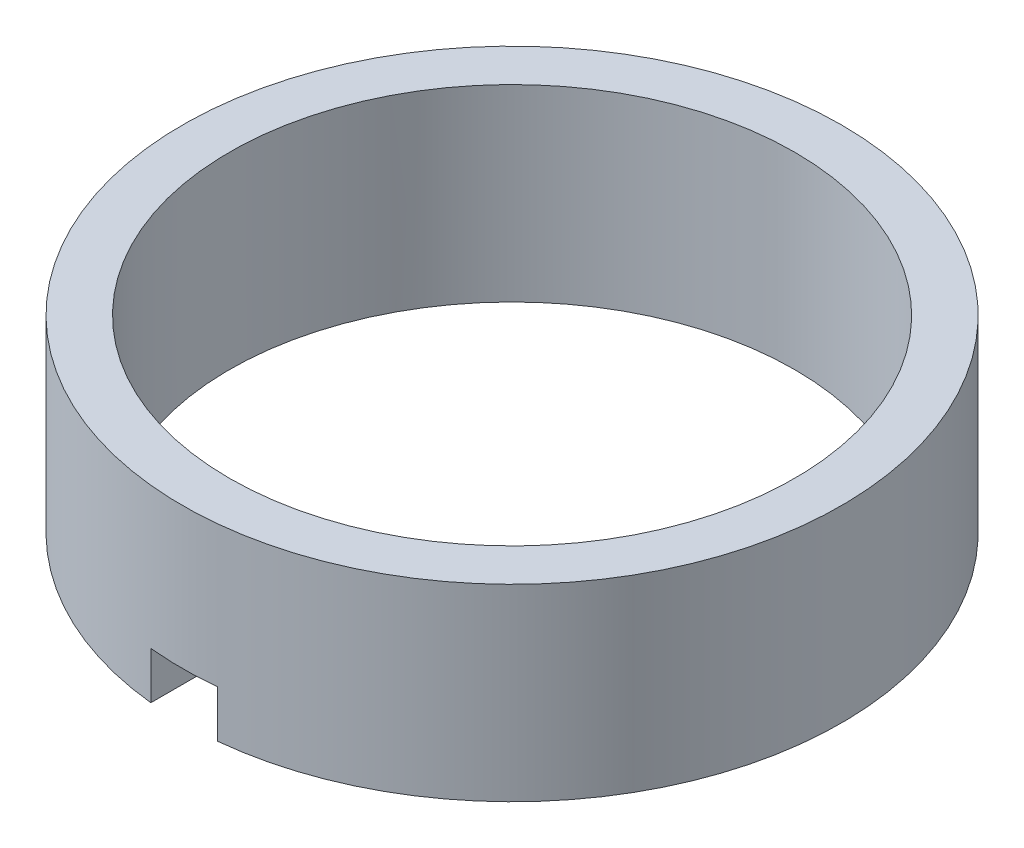
ISO-10303-21;
HEADER;
FILE_DESCRIPTION(('STEP AP214'),'2;1');
FILE_NAME('part.step','',(''),(''),'','','');
FILE_SCHEMA(('AUTOMOTIVE_DESIGN { 1 0 10303 214 1 1 1 1 }'));
ENDSEC;
DATA;
#1=APPLICATION_CONTEXT('core data for automotive mechanical design processes');
#2=APPLICATION_PROTOCOL_DEFINITION('international standard','automotive_design',2000,#1);
#3=PRODUCT_CONTEXT('',#1,'mechanical');
#4=PRODUCT('Part','Part','',(#3));
#5=PRODUCT_RELATED_PRODUCT_CATEGORY('part','',(#4));
#6=PRODUCT_DEFINITION_FORMATION('','',#4);
#7=PRODUCT_DEFINITION_CONTEXT('part definition',#1,'design');
#8=PRODUCT_DEFINITION('design','',#6,#7);
#9=PRODUCT_DEFINITION_SHAPE('','',#8);
#10=(LENGTH_UNIT() NAMED_UNIT(*) SI_UNIT(.MILLI.,.METRE.));
#11=(NAMED_UNIT(*) PLANE_ANGLE_UNIT() SI_UNIT($,.RADIAN.));
#12=(NAMED_UNIT(*) SI_UNIT($,.STERADIAN.) SOLID_ANGLE_UNIT());
#13=UNCERTAINTY_MEASURE_WITH_UNIT(LENGTH_MEASURE(1.E-05),#10,'distance_accuracy_value','');
#14=(GEOMETRIC_REPRESENTATION_CONTEXT(3) GLOBAL_UNCERTAINTY_ASSIGNED_CONTEXT((#13)) GLOBAL_UNIT_ASSIGNED_CONTEXT((#10,
#11,#12)) REPRESENTATION_CONTEXT('',''));
#15=CARTESIAN_POINT('',(0.,0.,0.));
#16=DIRECTION('',(0.,0.,1.));
#17=DIRECTION('',(1.,0.,0.));
#18=AXIS2_PLACEMENT_3D('',#15,#16,#17);
#19=CARTESIAN_POINT('',(-114.3254,-38.1,0.));
#20=DIRECTION('',(0.,1.,0.));
#21=DIRECTION('',(0.,0.,1.));
#22=AXIS2_PLACEMENT_3D('',#19,#20,#21);
#23=PLANE('',#22);
#24=DIRECTION('',(0.,0.,-1.));
#25=VECTOR('',#24,1.);
#26=CARTESIAN_POINT('',(13.4874,-38.1,0.));
#27=LINE('',#26,#25);
#28=CARTESIAN_POINT('',(13.4874,-38.1,132.666169543105));
#29=VERTEX_POINT('',#28);
#30=CARTESIAN_POINT('',(13.4874,-38.1,113.52703257991));
#31=VERTEX_POINT('',#30);
#32=EDGE_CURVE('E80',#29,#31,#27,.T.);
#33=ORIENTED_EDGE('',*,*,#32,.T.);
#34=CARTESIAN_POINT('',(0.,-38.1,0.));
#35=DIRECTION('',(0.,-1.,0.));
#36=DIRECTION('',(0.,0.,-1.));
#37=AXIS2_PLACEMENT_3D('',#34,#35,#36);
#38=CIRCLE('',#37,114.3254);
#39=CARTESIAN_POINT('',(-13.4874,-38.1,113.52703257991));
#40=VERTEX_POINT('',#39);
#41=EDGE_CURVE('E97',#40,#31,#38,.T.);
#42=ORIENTED_EDGE('',*,*,#41,.F.);
#43=DIRECTION('',(0.,0.,1.));
#44=VECTOR('',#43,1.);
#45=CARTESIAN_POINT('',(-13.4874,-38.1,0.));
#46=LINE('',#45,#44);
#47=CARTESIAN_POINT('',(-13.4874,-38.1,132.666169543105));
#48=VERTEX_POINT('',#47);
#49=EDGE_CURVE('E90',#40,#48,#46,.T.);
#50=ORIENTED_EDGE('',*,*,#49,.T.);
#51=CARTESIAN_POINT('',(0.,-38.1,0.));
#52=DIRECTION('',(0.,-1.,0.));
#53=DIRECTION('',(0.,0.,-1.));
#54=AXIS2_PLACEMENT_3D('',#51,#52,#53);
#55=CIRCLE('',#54,133.35);
#56=EDGE_CURVE('E96',#48,#29,#55,.T.);
#57=ORIENTED_EDGE('',*,*,#56,.T.);
#58=EDGE_LOOP('',(#33,#42,#50,#57));
#59=FACE_BOUND('',#58,.T.);
#60=ADVANCED_FACE('F43',(#59),#23,.F.);
#61=CARTESIAN_POINT('',(0.,-63.5,0.));
#62=DIRECTION('',(0.,-1.,0.));
#63=DIRECTION('',(0.,0.,-1.));
#64=AXIS2_PLACEMENT_3D('',#61,#62,#63);
#65=CYLINDRICAL_SURFACE('',#64,133.35);
#66=CARTESIAN_POINT('',(0.,38.1,0.));
#67=DIRECTION('',(0.,-1.,0.));
#68=DIRECTION('',(0.,0.,-1.));
#69=AXIS2_PLACEMENT_3D('',#66,#67,#68);
#70=CIRCLE('',#69,133.35);
#71=CARTESIAN_POINT('',(0.,38.1,-133.35));
#72=VERTEX_POINT('',#71);
#73=EDGE_CURVE('E102',#72,#72,#70,.T.);
#74=ORIENTED_EDGE('',*,*,#73,.T.);
#75=EDGE_LOOP('',(#74));
#76=FACE_BOUND('',#75,.T.);
#77=DIRECTION('',(0.,-1.,0.));
#78=VECTOR('',#77,1.);
#79=CARTESIAN_POINT('',(13.4874,-63.5,132.666169543105));
#80=LINE('',#79,#78);
#81=CARTESIAN_POINT('',(13.4874,-19.05,132.666169543105));
#82=VERTEX_POINT('',#81);
#83=EDGE_CURVE('E84',#29,#82,#80,.F.);
#84=ORIENTED_EDGE('',*,*,#83,.F.);
#85=ORIENTED_EDGE('',*,*,#56,.F.);
#86=DIRECTION('',(0.,-1.,0.));
#87=VECTOR('',#86,1.);
#88=CARTESIAN_POINT('',(-13.4874,-63.5,132.666169543105));
#89=LINE('',#88,#87);
#90=CARTESIAN_POINT('',(-13.4874,-19.05,132.666169543105));
#91=VERTEX_POINT('',#90);
#92=EDGE_CURVE('E98',#91,#48,#89,.T.);
#93=ORIENTED_EDGE('',*,*,#92,.F.);
#94=CARTESIAN_POINT('',(0.,-19.05,0.));
#95=DIRECTION('',(0.,-1.,0.));
#96=DIRECTION('',(0.,0.,-1.));
#97=AXIS2_PLACEMENT_3D('',#94,#95,#96);
#98=CIRCLE('',#97,133.35);
#99=EDGE_CURVE('E62',#82,#91,#98,.T.);
#100=ORIENTED_EDGE('',*,*,#99,.F.);
#101=EDGE_LOOP('',(#84,#85,#93,#100));
#102=FACE_BOUND('',#101,.T.);
#103=ADVANCED_FACE('F94',(#76,#102),#65,.T.);
#104=CARTESIAN_POINT('',(0.,-63.5,0.));
#105=DIRECTION('',(0.,-1.,0.));
#106=DIRECTION('',(0.,0.,-1.));
#107=AXIS2_PLACEMENT_3D('',#104,#105,#106);
#108=CYLINDRICAL_SURFACE('',#107,114.3254);
#109=CARTESIAN_POINT('',(0.,38.1,0.));
#110=DIRECTION('',(0.,-1.,0.));
#111=DIRECTION('',(0.,0.,-1.));
#112=AXIS2_PLACEMENT_3D('',#109,#110,#111);
#113=CIRCLE('',#112,114.3254);
#114=CARTESIAN_POINT('',(0.,38.1,-114.3254));
#115=VERTEX_POINT('',#114);
#116=EDGE_CURVE('E106',#115,#115,#113,.T.);
#117=ORIENTED_EDGE('',*,*,#116,.F.);
#118=EDGE_LOOP('',(#117));
#119=FACE_BOUND('',#118,.T.);
#120=DIRECTION('',(0.,-1.,0.));
#121=VECTOR('',#120,1.);
#122=CARTESIAN_POINT('',(13.4874,-63.5,113.52703257991));
#123=LINE('',#122,#121);
#124=CARTESIAN_POINT('',(13.4874,-19.05,113.52703257991));
#125=VERTEX_POINT('',#124);
#126=EDGE_CURVE('E11',#125,#31,#123,.T.);
#127=ORIENTED_EDGE('',*,*,#126,.F.);
#128=CARTESIAN_POINT('',(0.,-19.05,0.));
#129=DIRECTION('',(0.,-1.,0.));
#130=DIRECTION('',(0.,0.,-1.));
#131=AXIS2_PLACEMENT_3D('',#128,#129,#130);
#132=CIRCLE('',#131,114.3254);
#133=CARTESIAN_POINT('',(-13.4874,-19.05,113.52703257991));
#134=VERTEX_POINT('',#133);
#135=EDGE_CURVE('E101',#134,#125,#132,.F.);
#136=ORIENTED_EDGE('',*,*,#135,.F.);
#137=DIRECTION('',(0.,-1.,0.));
#138=VECTOR('',#137,1.);
#139=CARTESIAN_POINT('',(-13.4874,-63.5,113.52703257991));
#140=LINE('',#139,#138);
#141=EDGE_CURVE('E50',#40,#134,#140,.F.);
#142=ORIENTED_EDGE('',*,*,#141,.F.);
#143=ORIENTED_EDGE('',*,*,#41,.T.);
#144=EDGE_LOOP('',(#127,#136,#142,#143));
#145=FACE_BOUND('',#144,.T.);
#146=ADVANCED_FACE('F114',(#119,#145),#108,.F.);
#147=CARTESIAN_POINT('',(-133.35,38.1,0.));
#148=DIRECTION('',(0.,-1.,0.));
#149=DIRECTION('',(0.,0.,-1.));
#150=AXIS2_PLACEMENT_3D('',#147,#148,#149);
#151=PLANE('',#150);
#152=ORIENTED_EDGE('',*,*,#73,.F.);
#153=EDGE_LOOP('',(#152));
#154=FACE_BOUND('',#153,.T.);
#155=ORIENTED_EDGE('',*,*,#116,.T.);
#156=EDGE_LOOP('',(#155));
#157=FACE_BOUND('',#156,.T.);
#158=ADVANCED_FACE('F126',(#154,#157),#151,.F.);
#159=CARTESIAN_POINT('',(13.4874,-19.05,0.));
#160=DIRECTION('',(-1.,0.,0.));
#161=DIRECTION('',(0.,0.,1.));
#162=AXIS2_PLACEMENT_3D('',#159,#160,#161);
#163=PLANE('',#162);
#164=ORIENTED_EDGE('',*,*,#83,.T.);
#165=DIRECTION('',(0.,0.,-1.));
#166=VECTOR('',#165,1.);
#167=CARTESIAN_POINT('',(13.4874,-19.05,0.));
#168=LINE('',#167,#166);
#169=EDGE_CURVE('E116',#82,#125,#168,.T.);
#170=ORIENTED_EDGE('',*,*,#169,.T.);
#171=ORIENTED_EDGE('',*,*,#126,.T.);
#172=ORIENTED_EDGE('',*,*,#32,.F.);
#173=EDGE_LOOP('',(#164,#170,#171,#172));
#174=FACE_BOUND('',#173,.T.);
#175=ADVANCED_FACE('F82',(#174),#163,.T.);
#176=CARTESIAN_POINT('',(-13.4874,-19.05,0.));
#177=DIRECTION('',(1.,0.,0.));
#178=DIRECTION('',(0.,0.,-1.));
#179=AXIS2_PLACEMENT_3D('',#176,#177,#178);
#180=PLANE('',#179);
#181=ORIENTED_EDGE('',*,*,#92,.T.);
#182=ORIENTED_EDGE('',*,*,#49,.F.);
#183=ORIENTED_EDGE('',*,*,#141,.T.);
#184=DIRECTION('',(0.,0.,1.));
#185=VECTOR('',#184,1.);
#186=CARTESIAN_POINT('',(-13.4874,-19.05,0.));
#187=LINE('',#186,#185);
#188=EDGE_CURVE('E57',#134,#91,#187,.T.);
#189=ORIENTED_EDGE('',*,*,#188,.T.);
#190=EDGE_LOOP('',(#181,#182,#183,#189));
#191=FACE_BOUND('',#190,.T.);
#192=ADVANCED_FACE('F112',(#191),#180,.T.);
#193=CARTESIAN_POINT('',(0.,-19.05,0.));
#194=DIRECTION('',(0.,-1.,0.));
#195=DIRECTION('',(0.,0.,-1.));
#196=AXIS2_PLACEMENT_3D('',#193,#194,#195);
#197=PLANE('',#196);
#198=ORIENTED_EDGE('',*,*,#99,.T.);
#199=ORIENTED_EDGE('',*,*,#188,.F.);
#200=ORIENTED_EDGE('',*,*,#135,.T.);
#201=ORIENTED_EDGE('',*,*,#169,.F.);
#202=EDGE_LOOP('',(#198,#199,#200,#201));
#203=FACE_BOUND('',#202,.T.);
#204=ADVANCED_FACE('F115',(#203),#197,.T.);
#205=CLOSED_SHELL('',(#60,#103,#146,#158,#175,#192,#204));
#206=MANIFOLD_SOLID_BREP('B2',#205);
#207=ADVANCED_BREP_SHAPE_REPRESENTATION('',(#18,#206),#14);
#208=SHAPE_DEFINITION_REPRESENTATION(#9,#207);
ENDSEC;
END-ISO-10303-21;
